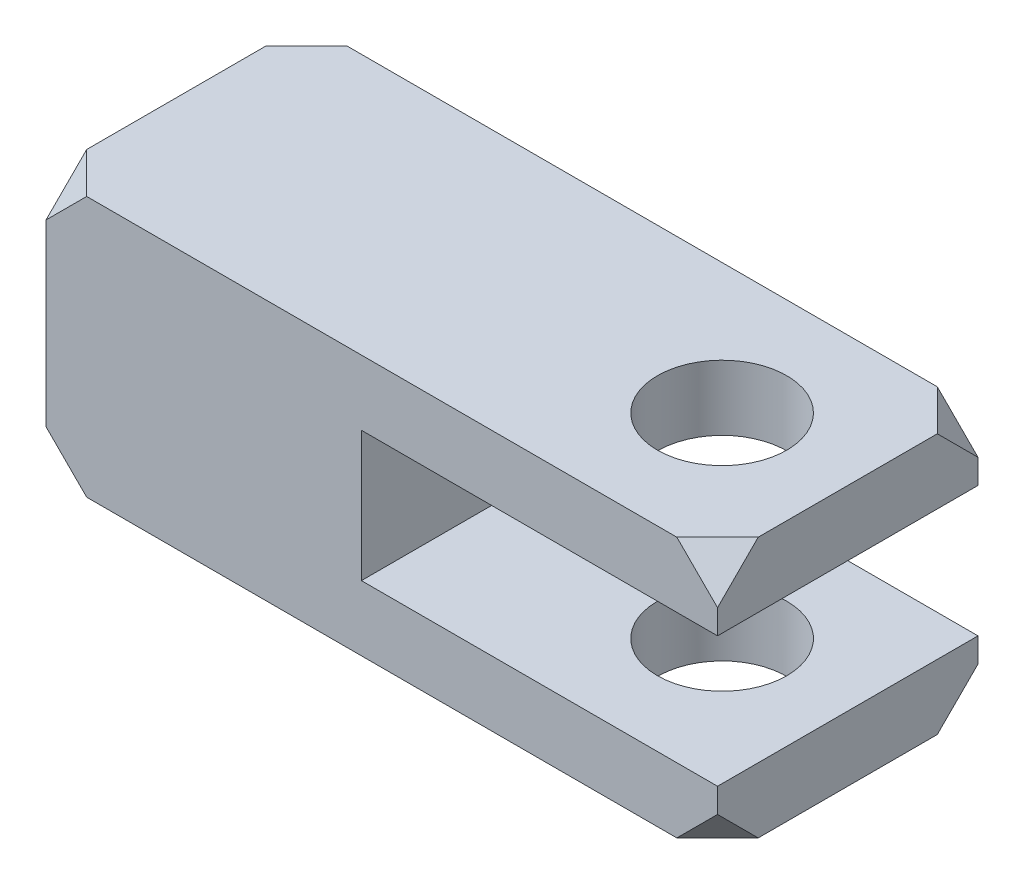
ISO-10303-21;
HEADER;
FILE_DESCRIPTION(('STEP AP214'),'2;1');
FILE_NAME('part.step','',(''),(''),'','','');
FILE_SCHEMA(('AUTOMOTIVE_DESIGN { 1 0 10303 214 1 1 1 1 }'));
ENDSEC;
DATA;
#1=APPLICATION_CONTEXT('core data for automotive mechanical design processes');
#2=APPLICATION_PROTOCOL_DEFINITION('international standard','automotive_design',2000,#1);
#3=PRODUCT_CONTEXT('',#1,'mechanical');
#4=PRODUCT('Part','Part','',(#3));
#5=PRODUCT_RELATED_PRODUCT_CATEGORY('part','',(#4));
#6=PRODUCT_DEFINITION_FORMATION('','',#4);
#7=PRODUCT_DEFINITION_CONTEXT('part definition',#1,'design');
#8=PRODUCT_DEFINITION('design','',#6,#7);
#9=PRODUCT_DEFINITION_SHAPE('','',#8);
#10=(LENGTH_UNIT() NAMED_UNIT(*) SI_UNIT(.MILLI.,.METRE.));
#11=(NAMED_UNIT(*) PLANE_ANGLE_UNIT() SI_UNIT($,.RADIAN.));
#12=(NAMED_UNIT(*) SI_UNIT($,.STERADIAN.) SOLID_ANGLE_UNIT());
#13=UNCERTAINTY_MEASURE_WITH_UNIT(LENGTH_MEASURE(1.E-05),#10,'distance_accuracy_value','');
#14=(GEOMETRIC_REPRESENTATION_CONTEXT(3) GLOBAL_UNCERTAINTY_ASSIGNED_CONTEXT((#13)) GLOBAL_UNIT_ASSIGNED_CONTEXT((#10,
#11,#12)) REPRESENTATION_CONTEXT('',''));
#15=CARTESIAN_POINT('',(0.,0.,0.));
#16=DIRECTION('',(0.,0.,1.));
#17=DIRECTION('',(1.,0.,0.));
#18=AXIS2_PLACEMENT_3D('',#15,#16,#17);
#19=CARTESIAN_POINT('',(33.,0.,0.));
#20=DIRECTION('',(1.,0.,0.));
#21=DIRECTION('',(0.,0.,-1.));
#22=AXIS2_PLACEMENT_3D('',#19,#20,#21);
#23=PLANE('',#22);
#24=DIRECTION('',(0.,-1.,0.));
#25=VECTOR('',#24,1.);
#26=CARTESIAN_POINT('',(33.,-6.39999999999996,6.40000000000004));
#27=LINE('',#26,#25);
#28=CARTESIAN_POINT('',(33.,-3.2,6.40000000000005));
#29=VERTEX_POINT('',#28);
#30=CARTESIAN_POINT('',(33.,-4.39999999999998,6.40000000000004));
#31=VERTEX_POINT('',#30);
#32=EDGE_CURVE('E246',#29,#31,#27,.T.);
#33=ORIENTED_EDGE('',*,*,#32,.T.);
#34=DIRECTION('',(0.,-0.707106781186547,-0.707106781186547));
#35=VECTOR('',#34,1.);
#36=CARTESIAN_POINT('',(33.,-5.40000000000001,5.40000000000001));
#37=LINE('',#36,#35);
#38=CARTESIAN_POINT('',(33.,-6.39999999999996,4.40000000000006));
#39=VERTEX_POINT('',#38);
#40=EDGE_CURVE('E194',#31,#39,#37,.T.);
#41=ORIENTED_EDGE('',*,*,#40,.T.);
#42=DIRECTION('',(0.,0.,-1.));
#43=VECTOR('',#42,1.);
#44=CARTESIAN_POINT('',(33.,-6.39999999999996,6.40000000000004));
#45=LINE('',#44,#43);
#46=CARTESIAN_POINT('',(33.,-6.39999999999996,-4.39999999999996));
#47=VERTEX_POINT('',#46);
#48=EDGE_CURVE('E240',#39,#47,#45,.T.);
#49=ORIENTED_EDGE('',*,*,#48,.T.);
#50=DIRECTION('',(0.,0.707106781186547,-0.707106781186547));
#51=VECTOR('',#50,1.);
#52=CARTESIAN_POINT('',(33.,-5.39999999999996,-5.39999999999996));
#53=LINE('',#52,#51);
#54=CARTESIAN_POINT('',(33.,-4.39999999999998,-6.39999999999993));
#55=VERTEX_POINT('',#54);
#56=EDGE_CURVE('E202',#47,#55,#53,.T.);
#57=ORIENTED_EDGE('',*,*,#56,.T.);
#58=DIRECTION('',(0.,1.,0.));
#59=VECTOR('',#58,1.);
#60=CARTESIAN_POINT('',(33.,-6.39999999999996,-6.39999999999993));
#61=LINE('',#60,#59);
#62=CARTESIAN_POINT('',(33.,-3.2,-6.40000000000004));
#63=VERTEX_POINT('',#62);
#64=EDGE_CURVE('E249',#55,#63,#61,.T.);
#65=ORIENTED_EDGE('',*,*,#64,.T.);
#66=DIRECTION('',(0.,0.,-1.));
#67=VECTOR('',#66,1.);
#68=CARTESIAN_POINT('',(33.,-3.2,6.40000000000005));
#69=LINE('',#68,#67);
#70=EDGE_CURVE('E267',#29,#63,#69,.T.);
#71=ORIENTED_EDGE('',*,*,#70,.F.);
#72=EDGE_LOOP('',(#33,#41,#49,#57,#65,#71));
#73=FACE_BOUND('',#72,.T.);
#74=ADVANCED_FACE('F36',(#73),#23,.T.);
#75=CARTESIAN_POINT('',(33.,3.2,-6.39999999999993));
#76=VERTEX_POINT('',#75);
#77=CARTESIAN_POINT('',(33.,4.40000000000003,-6.39999999999993));
#78=VERTEX_POINT('',#77);
#79=EDGE_CURVE('E251',#76,#78,#61,.T.);
#80=ORIENTED_EDGE('',*,*,#79,.T.);
#81=DIRECTION('',(0.,0.707106781186548,0.707106781186547));
#82=VECTOR('',#81,1.);
#83=CARTESIAN_POINT('',(33.,5.39999999999998,-5.39999999999999));
#84=LINE('',#83,#82);
#85=CARTESIAN_POINT('',(33.,6.40000000000002,-4.39999999999994));
#86=VERTEX_POINT('',#85);
#87=EDGE_CURVE('E211',#78,#86,#84,.T.);
#88=ORIENTED_EDGE('',*,*,#87,.T.);
#89=DIRECTION('',(0.,0.,1.));
#90=VECTOR('',#89,1.);
#91=CARTESIAN_POINT('',(33.,6.40000000000004,6.40000000000004));
#92=LINE('',#91,#90);
#93=CARTESIAN_POINT('',(33.,6.40000000000004,4.40000000000006));
#94=VERTEX_POINT('',#93);
#95=EDGE_CURVE('E247',#86,#94,#92,.T.);
#96=ORIENTED_EDGE('',*,*,#95,.T.);
#97=DIRECTION('',(0.,-0.707106781186547,0.707106781186548));
#98=VECTOR('',#97,1.);
#99=CARTESIAN_POINT('',(33.,5.40000000000006,5.40000000000004));
#100=LINE('',#99,#98);
#101=CARTESIAN_POINT('',(33.,4.40000000000007,6.40000000000004));
#102=VERTEX_POINT('',#101);
#103=EDGE_CURVE('E214',#94,#102,#100,.T.);
#104=ORIENTED_EDGE('',*,*,#103,.T.);
#105=CARTESIAN_POINT('',(33.,3.2,6.40000000000005));
#106=VERTEX_POINT('',#105);
#107=EDGE_CURVE('E236',#102,#106,#27,.T.);
#108=ORIENTED_EDGE('',*,*,#107,.T.);
#109=DIRECTION('',(0.,0.,1.));
#110=VECTOR('',#109,1.);
#111=CARTESIAN_POINT('',(33.,3.2,6.40000000000005));
#112=LINE('',#111,#110);
#113=EDGE_CURVE('E263',#76,#106,#112,.T.);
#114=ORIENTED_EDGE('',*,*,#113,.F.);
#115=EDGE_LOOP('',(#80,#88,#96,#104,#108,#114));
#116=FACE_BOUND('',#115,.T.);
#117=ADVANCED_FACE('F343',(#116),#23,.T.);
#118=CARTESIAN_POINT('',(33.,-6.39999999999996,6.40000000000004));
#119=DIRECTION('',(0.,1.,0.));
#120=DIRECTION('',(0.,0.,1.));
#121=AXIS2_PLACEMENT_3D('',#118,#119,#120);
#122=PLANE('',#121);
#123=DIRECTION('',(-0.707106781186547,0.,0.707106781186547));
#124=VECTOR('',#123,1.);
#125=CARTESIAN_POINT('',(11.1,-6.39999999999996,-15.4999999999999));
#126=LINE('',#125,#124);
#127=CARTESIAN_POINT('',(2.,-6.39999999999996,-6.39999999999993));
#128=VERTEX_POINT('',#127);
#129=CARTESIAN_POINT('',(0.,-6.39999999999996,-4.39999999999994));
#130=VERTEX_POINT('',#129);
#131=EDGE_CURVE('E51',#128,#130,#126,.T.);
#132=ORIENTED_EDGE('',*,*,#131,.F.);
#133=DIRECTION('',(-1.,0.,0.));
#134=VECTOR('',#133,1.);
#135=CARTESIAN_POINT('',(33.,-6.39999999999996,-6.39999999999993));
#136=LINE('',#135,#134);
#137=CARTESIAN_POINT('',(31.,-6.39999999999996,-6.39999999999993));
#138=VERTEX_POINT('',#137);
#139=EDGE_CURVE('E159',#138,#128,#136,.T.);
#140=ORIENTED_EDGE('',*,*,#139,.F.);
#141=DIRECTION('',(-0.707106781186548,0.,-0.707106781186547));
#142=VECTOR('',#141,1.);
#143=CARTESIAN_POINT('',(38.4,-6.39999999999996,1.00000000000003));
#144=LINE('',#143,#142);
#145=EDGE_CURVE('E199',#47,#138,#144,.T.);
#146=ORIENTED_EDGE('',*,*,#145,.F.);
#147=ORIENTED_EDGE('',*,*,#48,.F.);
#148=DIRECTION('',(0.707106781186548,0.,-0.707106781186547));
#149=VECTOR('',#148,1.);
#150=CARTESIAN_POINT('',(32.,-6.39999999999996,5.40000000000005));
#151=LINE('',#150,#149);
#152=CARTESIAN_POINT('',(31.,-6.39999999999996,6.40000000000004));
#153=VERTEX_POINT('',#152);
#154=EDGE_CURVE('E191',#153,#39,#151,.T.);
#155=ORIENTED_EDGE('',*,*,#154,.F.);
#156=DIRECTION('',(-1.,0.,0.));
#157=VECTOR('',#156,1.);
#158=CARTESIAN_POINT('',(33.,-6.39999999999996,6.40000000000004));
#159=LINE('',#158,#157);
#160=CARTESIAN_POINT('',(2.,-6.39999999999996,6.40000000000004));
#161=VERTEX_POINT('',#160);
#162=EDGE_CURVE('E233',#153,#161,#159,.T.);
#163=ORIENTED_EDGE('',*,*,#162,.T.);
#164=DIRECTION('',(0.707106781186547,0.,0.707106781186547));
#165=VECTOR('',#164,1.);
#166=CARTESIAN_POINT('',(17.5,-6.39999999999996,21.9));
#167=LINE('',#166,#165);
#168=CARTESIAN_POINT('',(0.,-6.39999999999996,4.40000000000004));
#169=VERTEX_POINT('',#168);
#170=EDGE_CURVE('E170',#169,#161,#167,.T.);
#171=ORIENTED_EDGE('',*,*,#170,.F.);
#172=DIRECTION('',(0.,0.,-1.));
#173=VECTOR('',#172,1.);
#174=CARTESIAN_POINT('',(0.,-6.39999999999996,6.40000000000004));
#175=LINE('',#174,#173);
#176=EDGE_CURVE('E155',#169,#130,#175,.T.);
#177=ORIENTED_EDGE('',*,*,#176,.T.);
#178=EDGE_LOOP('',(#132,#140,#146,#147,#155,#163,#171,#177));
#179=FACE_BOUND('',#178,.T.);
#180=CARTESIAN_POINT('',(26.825,-6.39999999999998,0.));
#181=DIRECTION('',(0.,1.,0.));
#182=DIRECTION('',(0.,0.,1.));
#183=AXIS2_PLACEMENT_3D('',#180,#181,#182);
#184=CIRCLE('',#183,3.175);
#185=CARTESIAN_POINT('',(26.825,-6.39999999999997,3.17500000000008));
#186=VERTEX_POINT('',#185);
#187=EDGE_CURVE('E225',#186,#186,#184,.T.);
#188=ORIENTED_EDGE('',*,*,#187,.T.);
#189=EDGE_LOOP('',(#188));
#190=FACE_BOUND('',#189,.T.);
#191=ADVANCED_FACE('F38',(#179,#190),#122,.F.);
#192=CARTESIAN_POINT('',(33.,-6.39999999999996,-6.39999999999993));
#193=DIRECTION('',(0.,0.,1.));
#194=DIRECTION('',(1.,0.,0.));
#195=AXIS2_PLACEMENT_3D('',#192,#193,#194);
#196=PLANE('',#195);
#197=DIRECTION('',(0.707106781186547,-0.707106781186547,0.));
#198=VECTOR('',#197,1.);
#199=CARTESIAN_POINT('',(17.5,-21.9,-6.39999999999993));
#200=LINE('',#199,#198);
#201=CARTESIAN_POINT('',(0.,-4.39999999999996,-6.39999999999993));
#202=VERTEX_POINT('',#201);
#203=EDGE_CURVE('E44',#202,#128,#200,.T.);
#204=ORIENTED_EDGE('',*,*,#203,.F.);
#205=DIRECTION('',(0.,1.,0.));
#206=VECTOR('',#205,1.);
#207=CARTESIAN_POINT('',(0.,-6.39999999999996,-6.39999999999993));
#208=LINE('',#207,#206);
#209=CARTESIAN_POINT('',(0.,4.40000000000002,-6.39999999999993));
#210=VERTEX_POINT('',#209);
#211=EDGE_CURVE('E146',#202,#210,#208,.T.);
#212=ORIENTED_EDGE('',*,*,#211,.T.);
#213=DIRECTION('',(-0.707106781186548,-0.707106781186548,0.));
#214=VECTOR('',#213,1.);
#215=CARTESIAN_POINT('',(11.1,15.5,-6.39999999999993));
#216=LINE('',#215,#214);
#217=CARTESIAN_POINT('',(2.00000000000001,6.40000000000002,-6.39999999999994));
#218=VERTEX_POINT('',#217);
#219=EDGE_CURVE('E186',#218,#210,#216,.T.);
#220=ORIENTED_EDGE('',*,*,#219,.F.);
#221=DIRECTION('',(-1.,0.,0.));
#222=VECTOR('',#221,1.);
#223=CARTESIAN_POINT('',(33.,6.40000000000002,-6.39999999999993));
#224=LINE('',#223,#222);
#225=CARTESIAN_POINT('',(31.,6.40000000000002,-6.39999999999993));
#226=VERTEX_POINT('',#225);
#227=EDGE_CURVE('E227',#226,#218,#224,.T.);
#228=ORIENTED_EDGE('',*,*,#227,.F.);
#229=DIRECTION('',(-0.707106781186548,0.707106781186547,0.));
#230=VECTOR('',#229,1.);
#231=CARTESIAN_POINT('',(38.4,-0.999999999999956,-6.39999999999993));
#232=LINE('',#231,#230);
#233=EDGE_CURVE('E208',#78,#226,#232,.T.);
#234=ORIENTED_EDGE('',*,*,#233,.F.);
#235=ORIENTED_EDGE('',*,*,#79,.F.);
#236=DIRECTION('',(1.,0.,0.));
#237=VECTOR('',#236,1.);
#238=CARTESIAN_POINT('',(15.5,3.2,-6.40000000000004));
#239=LINE('',#238,#237);
#240=CARTESIAN_POINT('',(15.5,3.2,-6.40000000000004));
#241=VERTEX_POINT('',#240);
#242=EDGE_CURVE('E256',#241,#76,#239,.T.);
#243=ORIENTED_EDGE('',*,*,#242,.F.);
#244=DIRECTION('',(0.,1.,0.));
#245=VECTOR('',#244,1.);
#246=CARTESIAN_POINT('',(15.5,-3.2,-6.40000000000004));
#247=LINE('',#246,#245);
#248=CARTESIAN_POINT('',(15.5,-3.2,-6.40000000000004));
#249=VERTEX_POINT('',#248);
#250=EDGE_CURVE('E276',#249,#241,#247,.T.);
#251=ORIENTED_EDGE('',*,*,#250,.F.);
#252=DIRECTION('',(1.,0.,0.));
#253=VECTOR('',#252,1.);
#254=CARTESIAN_POINT('',(15.5,-3.2,-6.40000000000004));
#255=LINE('',#254,#253);
#256=EDGE_CURVE('E253',#249,#63,#255,.T.);
#257=ORIENTED_EDGE('',*,*,#256,.T.);
#258=ORIENTED_EDGE('',*,*,#64,.F.);
#259=DIRECTION('',(0.707106781186548,0.707106781186547,0.));
#260=VECTOR('',#259,1.);
#261=CARTESIAN_POINT('',(32.,-5.39999999999997,-6.39999999999993));
#262=LINE('',#261,#260);
#263=EDGE_CURVE('E196',#138,#55,#262,.T.);
#264=ORIENTED_EDGE('',*,*,#263,.F.);
#265=ORIENTED_EDGE('',*,*,#139,.T.);
#266=EDGE_LOOP('',(#204,#212,#220,#228,#234,#235,#243,#251,#257,#258,#264,#265));
#267=FACE_BOUND('',#266,.T.);
#268=ADVANCED_FACE('F158',(#267),#196,.F.);
#269=CARTESIAN_POINT('',(33.,6.40000000000004,6.40000000000004));
#270=DIRECTION('',(0.,-1.,0.));
#271=DIRECTION('',(0.,0.,-1.));
#272=AXIS2_PLACEMENT_3D('',#269,#270,#271);
#273=PLANE('',#272);
#274=DIRECTION('',(-0.707106781186548,0.,-0.707106781186548));
#275=VECTOR('',#274,1.);
#276=CARTESIAN_POINT('',(17.5,6.40000000000008,21.9));
#277=LINE('',#276,#275);
#278=CARTESIAN_POINT('',(2.00000000000001,6.40000000000005,6.40000000000004));
#279=VERTEX_POINT('',#278);
#280=CARTESIAN_POINT('',(0.,6.40000000000004,4.40000000000005));
#281=VERTEX_POINT('',#280);
#282=EDGE_CURVE('E179',#279,#281,#277,.T.);
#283=ORIENTED_EDGE('',*,*,#282,.F.);
#284=DIRECTION('',(-1.,0.,0.));
#285=VECTOR('',#284,1.);
#286=CARTESIAN_POINT('',(33.,6.40000000000004,6.40000000000004));
#287=LINE('',#286,#285);
#288=CARTESIAN_POINT('',(31.,6.40000000000004,6.40000000000004));
#289=VERTEX_POINT('',#288);
#290=EDGE_CURVE('E230',#289,#279,#287,.T.);
#291=ORIENTED_EDGE('',*,*,#290,.F.);
#292=DIRECTION('',(-0.707106781186548,0.,0.707106781186547));
#293=VECTOR('',#292,1.);
#294=CARTESIAN_POINT('',(32.,6.40000000000004,5.40000000000005));
#295=LINE('',#294,#293);
#296=EDGE_CURVE('E219',#94,#289,#295,.T.);
#297=ORIENTED_EDGE('',*,*,#296,.F.);
#298=ORIENTED_EDGE('',*,*,#95,.F.);
#299=DIRECTION('',(0.707106781186548,0.,0.707106781186547));
#300=VECTOR('',#299,1.);
#301=CARTESIAN_POINT('',(38.4,6.40000000000003,1.00000000000004));
#302=LINE('',#301,#300);
#303=EDGE_CURVE('E205',#226,#86,#302,.T.);
#304=ORIENTED_EDGE('',*,*,#303,.F.);
#305=ORIENTED_EDGE('',*,*,#227,.T.);
#306=DIRECTION('',(0.707106781186548,0.,-0.707106781186548));
#307=VECTOR('',#306,1.);
#308=CARTESIAN_POINT('',(11.1,6.4,-15.4999999999999));
#309=LINE('',#308,#307);
#310=CARTESIAN_POINT('',(0.,6.40000000000004,-4.39999999999991));
#311=VERTEX_POINT('',#310);
#312=EDGE_CURVE('E183',#311,#218,#309,.T.);
#313=ORIENTED_EDGE('',*,*,#312,.F.);
#314=DIRECTION('',(0.,0.,1.));
#315=VECTOR('',#314,1.);
#316=CARTESIAN_POINT('',(0.,6.40000000000004,6.40000000000004));
#317=LINE('',#316,#315);
#318=EDGE_CURVE('E154',#311,#281,#317,.T.);
#319=ORIENTED_EDGE('',*,*,#318,.T.);
#320=EDGE_LOOP('',(#283,#291,#297,#298,#304,#305,#313,#319));
#321=FACE_BOUND('',#320,.T.);
#322=CARTESIAN_POINT('',(26.825,6.40000000000003,0.));
#323=DIRECTION('',(0.,1.,0.));
#324=DIRECTION('',(0.,0.,1.));
#325=AXIS2_PLACEMENT_3D('',#322,#323,#324);
#326=CIRCLE('',#325,3.175);
#327=CARTESIAN_POINT('',(26.825,6.40000000000004,3.17500000000006));
#328=VERTEX_POINT('',#327);
#329=EDGE_CURVE('E288',#328,#328,#326,.T.);
#330=ORIENTED_EDGE('',*,*,#329,.F.);
#331=EDGE_LOOP('',(#330));
#332=FACE_BOUND('',#331,.T.);
#333=ADVANCED_FACE('F355',(#321,#332),#273,.F.);
#334=CARTESIAN_POINT('',(33.,-6.39999999999996,6.40000000000004));
#335=DIRECTION('',(0.,0.,-1.));
#336=DIRECTION('',(-1.,0.,0.));
#337=AXIS2_PLACEMENT_3D('',#334,#335,#336);
#338=PLANE('',#337);
#339=DIRECTION('',(-0.707106781186547,0.707106781186547,0.));
#340=VECTOR('',#339,1.);
#341=CARTESIAN_POINT('',(17.5,-21.9,6.40000000000004));
#342=LINE('',#341,#340);
#343=CARTESIAN_POINT('',(0.,-4.39999999999996,6.40000000000004));
#344=VERTEX_POINT('',#343);
#345=EDGE_CURVE('E165',#161,#344,#342,.T.);
#346=ORIENTED_EDGE('',*,*,#345,.F.);
#347=ORIENTED_EDGE('',*,*,#162,.F.);
#348=DIRECTION('',(-0.707106781186548,-0.707106781186547,0.));
#349=VECTOR('',#348,1.);
#350=CARTESIAN_POINT('',(32.,-5.39999999999997,6.40000000000004));
#351=LINE('',#350,#349);
#352=EDGE_CURVE('E188',#31,#153,#351,.T.);
#353=ORIENTED_EDGE('',*,*,#352,.F.);
#354=ORIENTED_EDGE('',*,*,#32,.F.);
#355=DIRECTION('',(1.,0.,0.));
#356=VECTOR('',#355,1.);
#357=CARTESIAN_POINT('',(15.5,-3.2,6.40000000000005));
#358=LINE('',#357,#356);
#359=CARTESIAN_POINT('',(15.5,-3.2,6.40000000000005));
#360=VERTEX_POINT('',#359);
#361=EDGE_CURVE('E244',#360,#29,#358,.T.);
#362=ORIENTED_EDGE('',*,*,#361,.F.);
#363=DIRECTION('',(0.,-1.,0.));
#364=VECTOR('',#363,1.);
#365=CARTESIAN_POINT('',(15.5,-3.2,6.40000000000005));
#366=LINE('',#365,#364);
#367=CARTESIAN_POINT('',(15.5,3.2,6.40000000000005));
#368=VERTEX_POINT('',#367);
#369=EDGE_CURVE('E257',#368,#360,#366,.T.);
#370=ORIENTED_EDGE('',*,*,#369,.F.);
#371=DIRECTION('',(1.,0.,0.));
#372=VECTOR('',#371,1.);
#373=CARTESIAN_POINT('',(15.5,3.2,6.40000000000005));
#374=LINE('',#373,#372);
#375=EDGE_CURVE('E259',#368,#106,#374,.T.);
#376=ORIENTED_EDGE('',*,*,#375,.T.);
#377=ORIENTED_EDGE('',*,*,#107,.F.);
#378=DIRECTION('',(0.707106781186548,-0.707106781186547,0.));
#379=VECTOR('',#378,1.);
#380=CARTESIAN_POINT('',(38.4,-0.999999999999938,6.40000000000004));
#381=LINE('',#380,#379);
#382=EDGE_CURVE('E217',#289,#102,#381,.T.);
#383=ORIENTED_EDGE('',*,*,#382,.F.);
#384=ORIENTED_EDGE('',*,*,#290,.T.);
#385=DIRECTION('',(0.707106781186548,0.707106781186548,0.));
#386=VECTOR('',#385,1.);
#387=CARTESIAN_POINT('',(11.1,15.5,6.40000000000004));
#388=LINE('',#387,#386);
#389=CARTESIAN_POINT('',(0.,4.40000000000004,6.40000000000004));
#390=VERTEX_POINT('',#389);
#391=EDGE_CURVE('E176',#390,#279,#388,.T.);
#392=ORIENTED_EDGE('',*,*,#391,.F.);
#393=DIRECTION('',(0.,-1.,0.));
#394=VECTOR('',#393,1.);
#395=CARTESIAN_POINT('',(0.,-6.39999999999996,6.40000000000004));
#396=LINE('',#395,#394);
#397=EDGE_CURVE('E237',#390,#344,#396,.T.);
#398=ORIENTED_EDGE('',*,*,#397,.T.);
#399=EDGE_LOOP('',(#346,#347,#353,#354,#362,#370,#376,#377,#383,#384,#392,#398));
#400=FACE_BOUND('',#399,.T.);
#401=ADVANCED_FACE('F320',(#400),#338,.F.);
#402=CARTESIAN_POINT('',(0.,0.,0.));
#403=DIRECTION('',(1.,0.,0.));
#404=DIRECTION('',(0.,0.,-1.));
#405=AXIS2_PLACEMENT_3D('',#402,#403,#404);
#406=PLANE('',#405);
#407=DIRECTION('',(0.,0.707106781186547,-0.707106781186547));
#408=VECTOR('',#407,1.);
#409=CARTESIAN_POINT('',(0.,-5.39999999999995,-5.39999999999995));
#410=LINE('',#409,#408);
#411=EDGE_CURVE('E11',#130,#202,#410,.T.);
#412=ORIENTED_EDGE('',*,*,#411,.F.);
#413=ORIENTED_EDGE('',*,*,#176,.F.);
#414=DIRECTION('',(0.,-0.707106781186547,-0.707106781186547));
#415=VECTOR('',#414,1.);
#416=CARTESIAN_POINT('',(0.,-5.4,5.4));
#417=LINE('',#416,#415);
#418=EDGE_CURVE('E162',#344,#169,#417,.T.);
#419=ORIENTED_EDGE('',*,*,#418,.F.);
#420=ORIENTED_EDGE('',*,*,#397,.F.);
#421=DIRECTION('',(0.,-0.707106781186547,0.707106781186548));
#422=VECTOR('',#421,1.);
#423=CARTESIAN_POINT('',(0.,5.40000000000005,5.40000000000004));
#424=LINE('',#423,#422);
#425=EDGE_CURVE('E173',#281,#390,#424,.T.);
#426=ORIENTED_EDGE('',*,*,#425,.F.);
#427=ORIENTED_EDGE('',*,*,#318,.F.);
#428=DIRECTION('',(0.,0.707106781186548,0.707106781186547));
#429=VECTOR('',#428,1.);
#430=CARTESIAN_POINT('',(0.,5.39999999999997,-5.39999999999998));
#431=LINE('',#430,#429);
#432=EDGE_CURVE('E151',#210,#311,#431,.T.);
#433=ORIENTED_EDGE('',*,*,#432,.F.);
#434=ORIENTED_EDGE('',*,*,#211,.F.);
#435=EDGE_LOOP('',(#412,#413,#419,#420,#426,#427,#433,#434));
#436=FACE_BOUND('',#435,.T.);
#437=CARTESIAN_POINT('',(0.,0.,0.));
#438=DIRECTION('',(-1.,0.,0.));
#439=DIRECTION('',(0.,0.,1.));
#440=AXIS2_PLACEMENT_3D('',#437,#438,#439);
#441=CIRCLE('',#440,3.175);
#442=CARTESIAN_POINT('',(0.,0.,3.175));
#443=VERTEX_POINT('',#442);
#444=EDGE_CURVE('E281',#443,#443,#441,.T.);
#445=ORIENTED_EDGE('',*,*,#444,.F.);
#446=EDGE_LOOP('',(#445));
#447=FACE_BOUND('',#446,.T.);
#448=ADVANCED_FACE('F148',(#436,#447),#406,.F.);
#449=CARTESIAN_POINT('',(15.5,-3.2,6.40000000000005));
#450=DIRECTION('',(0.,-1.,0.));
#451=DIRECTION('',(0.,0.,-1.));
#452=AXIS2_PLACEMENT_3D('',#449,#450,#451);
#453=PLANE('',#452);
#454=CARTESIAN_POINT('',(26.825,-3.2,0.));
#455=DIRECTION('',(0.,-1.,0.));
#456=DIRECTION('',(0.,0.,-1.));
#457=AXIS2_PLACEMENT_3D('',#454,#455,#456);
#458=CIRCLE('',#457,3.175);
#459=CARTESIAN_POINT('',(26.825,-3.2,-3.17499999999992));
#460=VERTEX_POINT('',#459);
#461=EDGE_CURVE('E224',#460,#460,#458,.T.);
#462=ORIENTED_EDGE('',*,*,#461,.T.);
#463=EDGE_LOOP('',(#462));
#464=FACE_BOUND('',#463,.T.);
#465=ORIENTED_EDGE('',*,*,#70,.T.);
#466=ORIENTED_EDGE('',*,*,#256,.F.);
#467=DIRECTION('',(0.,0.,-1.));
#468=VECTOR('',#467,1.);
#469=CARTESIAN_POINT('',(15.5,-3.2,6.40000000000005));
#470=LINE('',#469,#468);
#471=EDGE_CURVE('E266',#360,#249,#470,.T.);
#472=ORIENTED_EDGE('',*,*,#471,.F.);
#473=ORIENTED_EDGE('',*,*,#361,.T.);
#474=EDGE_LOOP('',(#465,#466,#472,#473));
#475=FACE_BOUND('',#474,.T.);
#476=ADVANCED_FACE('F303',(#464,#475),#453,.F.);
#477=CARTESIAN_POINT('',(15.5,3.2,6.40000000000005));
#478=DIRECTION('',(0.,1.,0.));
#479=DIRECTION('',(0.,0.,1.));
#480=AXIS2_PLACEMENT_3D('',#477,#478,#479);
#481=PLANE('',#480);
#482=CARTESIAN_POINT('',(26.825,3.2,0.));
#483=DIRECTION('',(0.,1.,0.));
#484=DIRECTION('',(0.,0.,1.));
#485=AXIS2_PLACEMENT_3D('',#482,#483,#484);
#486=CIRCLE('',#485,3.175);
#487=CARTESIAN_POINT('',(26.825,3.2,3.17500000000006));
#488=VERTEX_POINT('',#487);
#489=EDGE_CURVE('E221',#488,#488,#486,.T.);
#490=ORIENTED_EDGE('',*,*,#489,.T.);
#491=EDGE_LOOP('',(#490));
#492=FACE_BOUND('',#491,.T.);
#493=ORIENTED_EDGE('',*,*,#113,.T.);
#494=ORIENTED_EDGE('',*,*,#375,.F.);
#495=DIRECTION('',(0.,0.,1.));
#496=VECTOR('',#495,1.);
#497=CARTESIAN_POINT('',(15.5,3.2,6.40000000000005));
#498=LINE('',#497,#496);
#499=EDGE_CURVE('E273',#241,#368,#498,.T.);
#500=ORIENTED_EDGE('',*,*,#499,.F.);
#501=ORIENTED_EDGE('',*,*,#242,.T.);
#502=EDGE_LOOP('',(#493,#494,#500,#501));
#503=FACE_BOUND('',#502,.T.);
#504=ADVANCED_FACE('F306',(#492,#503),#481,.F.);
#505=CARTESIAN_POINT('',(15.5,0.,0.));
#506=DIRECTION('',(1.,0.,0.));
#507=DIRECTION('',(0.,0.,-1.));
#508=AXIS2_PLACEMENT_3D('',#505,#506,#507);
#509=PLANE('',#508);
#510=ORIENTED_EDGE('',*,*,#471,.T.);
#511=ORIENTED_EDGE('',*,*,#250,.T.);
#512=ORIENTED_EDGE('',*,*,#499,.T.);
#513=ORIENTED_EDGE('',*,*,#369,.T.);
#514=EDGE_LOOP('',(#510,#511,#512,#513));
#515=FACE_BOUND('',#514,.T.);
#516=ADVANCED_FACE('F317',(#515),#509,.T.);
#517=CARTESIAN_POINT('',(12.7,0.,0.));
#518=DIRECTION('',(-1.,0.,0.));
#519=DIRECTION('',(0.,0.,1.));
#520=AXIS2_PLACEMENT_3D('',#517,#518,#519);
#521=CYLINDRICAL_SURFACE('',#520,3.175);
#522=CARTESIAN_POINT('',(12.7,0.,0.));
#523=DIRECTION('',(-1.,0.,0.));
#524=DIRECTION('',(0.,0.,1.));
#525=AXIS2_PLACEMENT_3D('',#522,#523,#524);
#526=CIRCLE('',#525,3.175);
#527=CARTESIAN_POINT('',(12.7,0.,3.175));
#528=VERTEX_POINT('',#527);
#529=EDGE_CURVE('E270',#528,#528,#526,.T.);
#530=ORIENTED_EDGE('',*,*,#529,.F.);
#531=EDGE_LOOP('',(#530));
#532=FACE_BOUND('',#531,.T.);
#533=ORIENTED_EDGE('',*,*,#444,.T.);
#534=EDGE_LOOP('',(#533));
#535=FACE_BOUND('',#534,.T.);
#536=ADVANCED_FACE('F474',(#532,#535),#521,.F.);
#537=CARTESIAN_POINT('',(12.7,0.,0.));
#538=DIRECTION('',(-1.,0.,0.));
#539=DIRECTION('',(0.,0.,1.));
#540=AXIS2_PLACEMENT_3D('',#537,#538,#539);
#541=PLANE('',#540);
#542=ORIENTED_EDGE('',*,*,#529,.T.);
#543=EDGE_LOOP('',(#542));
#544=FACE_BOUND('',#543,.T.);
#545=ADVANCED_FACE('F481',(#544),#541,.T.);
#546=CARTESIAN_POINT('',(26.825,-6.39999999999998,0.));
#547=DIRECTION('',(0.,1.,0.));
#548=DIRECTION('',(0.,0.,1.));
#549=AXIS2_PLACEMENT_3D('',#546,#547,#548);
#550=CYLINDRICAL_SURFACE('',#549,3.175);
#551=ORIENTED_EDGE('',*,*,#329,.T.);
#552=EDGE_LOOP('',(#551));
#553=FACE_BOUND('',#552,.T.);
#554=ORIENTED_EDGE('',*,*,#489,.F.);
#555=EDGE_LOOP('',(#554));
#556=FACE_BOUND('',#555,.T.);
#557=ADVANCED_FACE('F299',(#553,#556),#550,.F.);
#558=ORIENTED_EDGE('',*,*,#187,.F.);
#559=EDGE_LOOP('',(#558));
#560=FACE_BOUND('',#559,.T.);
#561=ORIENTED_EDGE('',*,*,#461,.F.);
#562=EDGE_LOOP('',(#561));
#563=FACE_BOUND('',#562,.T.);
#564=ADVANCED_FACE('F295',(#560,#563),#550,.F.);
#565=CARTESIAN_POINT('',(14.6,14.6,14.6));
#566=DIRECTION('',(0.577350269189625,0.577350269189627,0.577350269189625));
#567=DIRECTION('',(0.,-0.707106781186547,0.707106781186548));
#568=AXIS2_PLACEMENT_3D('',#565,#566,#567);
#569=PLANE('',#568);
#570=ORIENTED_EDGE('',*,*,#103,.F.);
#571=ORIENTED_EDGE('',*,*,#296,.T.);
#572=ORIENTED_EDGE('',*,*,#382,.T.);
#573=EDGE_LOOP('',(#570,#571,#572));
#574=FACE_BOUND('',#573,.T.);
#575=ADVANCED_FACE('F298',(#574),#569,.T.);
#576=CARTESIAN_POINT('',(14.5999999999999,14.6,-14.6));
#577=DIRECTION('',(0.577350269189625,0.577350269189626,-0.577350269189627));
#578=DIRECTION('',(0.,0.707106781186548,0.707106781186547));
#579=AXIS2_PLACEMENT_3D('',#576,#577,#578);
#580=PLANE('',#579);
#581=ORIENTED_EDGE('',*,*,#87,.F.);
#582=ORIENTED_EDGE('',*,*,#233,.T.);
#583=ORIENTED_EDGE('',*,*,#303,.T.);
#584=EDGE_LOOP('',(#581,#582,#583));
#585=FACE_BOUND('',#584,.T.);
#586=ADVANCED_FACE('F332',(#585),#580,.T.);
#587=CARTESIAN_POINT('',(14.5999999999999,-14.6,-14.6));
#588=DIRECTION('',(0.577350269189625,-0.577350269189626,-0.577350269189626));
#589=DIRECTION('',(0.,0.707106781186547,-0.707106781186547));
#590=AXIS2_PLACEMENT_3D('',#587,#588,#589);
#591=PLANE('',#590);
#592=ORIENTED_EDGE('',*,*,#56,.F.);
#593=ORIENTED_EDGE('',*,*,#145,.T.);
#594=ORIENTED_EDGE('',*,*,#263,.T.);
#595=EDGE_LOOP('',(#592,#593,#594));
#596=FACE_BOUND('',#595,.T.);
#597=ADVANCED_FACE('F330',(#596),#591,.T.);
#598=CARTESIAN_POINT('',(14.6,-14.6,14.6));
#599=DIRECTION('',(0.577350269189625,-0.577350269189626,0.577350269189626));
#600=DIRECTION('',(0.,-0.707106781186547,-0.707106781186547));
#601=AXIS2_PLACEMENT_3D('',#598,#599,#600);
#602=PLANE('',#601);
#603=ORIENTED_EDGE('',*,*,#40,.F.);
#604=ORIENTED_EDGE('',*,*,#352,.T.);
#605=ORIENTED_EDGE('',*,*,#154,.T.);
#606=EDGE_LOOP('',(#603,#604,#605));
#607=FACE_BOUND('',#606,.T.);
#608=ADVANCED_FACE('F324',(#607),#602,.T.);
#609=CARTESIAN_POINT('',(-3.59999999999998,3.59999999999998,-3.59999999999999));
#610=DIRECTION('',(-0.577350269189625,0.577350269189625,-0.577350269189627));
#611=DIRECTION('',(-0.707106781186548,0.,0.707106781186547));
#612=AXIS2_PLACEMENT_3D('',#609,#610,#611);
#613=PLANE('',#612);
#614=ORIENTED_EDGE('',*,*,#312,.T.);
#615=ORIENTED_EDGE('',*,*,#219,.T.);
#616=ORIENTED_EDGE('',*,*,#432,.T.);
#617=EDGE_LOOP('',(#614,#615,#616));
#618=FACE_BOUND('',#617,.T.);
#619=ADVANCED_FACE('F338',(#618),#613,.T.);
#620=CARTESIAN_POINT('',(-3.60000000000003,3.60000000000003,3.60000000000002));
#621=DIRECTION('',(-0.577350269189626,0.577350269189626,0.577350269189625));
#622=DIRECTION('',(-0.707106781186548,-0.707106781186548,0.));
#623=AXIS2_PLACEMENT_3D('',#620,#621,#622);
#624=PLANE('',#623);
#625=ORIENTED_EDGE('',*,*,#391,.T.);
#626=ORIENTED_EDGE('',*,*,#282,.T.);
#627=ORIENTED_EDGE('',*,*,#425,.T.);
#628=EDGE_LOOP('',(#625,#626,#627));
#629=FACE_BOUND('',#628,.T.);
#630=ADVANCED_FACE('F403',(#629),#624,.T.);
#631=CARTESIAN_POINT('',(-3.6,-3.6,3.6));
#632=DIRECTION('',(-0.577350269189626,-0.577350269189626,0.577350269189626));
#633=DIRECTION('',(0.707106781186547,0.,0.707106781186547));
#634=AXIS2_PLACEMENT_3D('',#631,#632,#633);
#635=PLANE('',#634);
#636=ORIENTED_EDGE('',*,*,#418,.T.);
#637=ORIENTED_EDGE('',*,*,#170,.T.);
#638=ORIENTED_EDGE('',*,*,#345,.T.);
#639=EDGE_LOOP('',(#636,#637,#638));
#640=FACE_BOUND('',#639,.T.);
#641=ADVANCED_FACE('F421',(#640),#635,.T.);
#642=CARTESIAN_POINT('',(-3.59999999999996,-3.59999999999996,-3.59999999999996));
#643=DIRECTION('',(-0.577350269189626,-0.577350269189626,-0.577350269189626));
#644=DIRECTION('',(-0.707106781186547,0.,0.707106781186547));
#645=AXIS2_PLACEMENT_3D('',#642,#643,#644);
#646=PLANE('',#645);
#647=ORIENTED_EDGE('',*,*,#203,.T.);
#648=ORIENTED_EDGE('',*,*,#131,.T.);
#649=ORIENTED_EDGE('',*,*,#411,.T.);
#650=EDGE_LOOP('',(#647,#648,#649));
#651=FACE_BOUND('',#650,.T.);
#652=ADVANCED_FACE('F161',(#651),#646,.T.);
#653=CLOSED_SHELL('',(#74,#117,#191,#268,#333,#401,#448,#476,#504,#516,#536,#545,#557,#564,#575,
#586,#597,#608,#619,#630,#641,#652));
#654=MANIFOLD_SOLID_BREP('B2',#653);
#655=ADVANCED_BREP_SHAPE_REPRESENTATION('',(#18,#654),#14);
#656=SHAPE_DEFINITION_REPRESENTATION(#9,#655);
ENDSEC;
END-ISO-10303-21;
